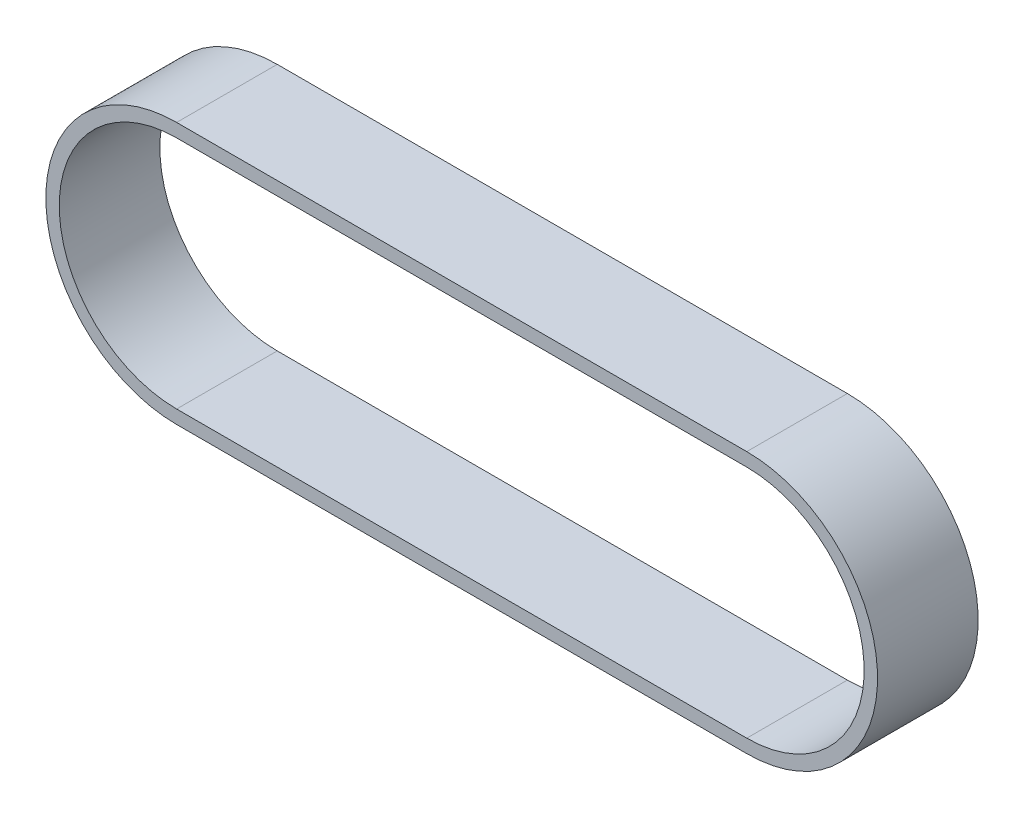
ISO-10303-21;
HEADER;
FILE_DESCRIPTION(('STEP AP214'),'2;1');
FILE_NAME('part.step','',(''),(''),'','','');
FILE_SCHEMA(('AUTOMOTIVE_DESIGN { 1 0 10303 214 1 1 1 1 }'));
ENDSEC;
DATA;
#1=APPLICATION_CONTEXT('core data for automotive mechanical design processes');
#2=APPLICATION_PROTOCOL_DEFINITION('international standard','automotive_design',2000,#1);
#3=PRODUCT_CONTEXT('',#1,'mechanical');
#4=PRODUCT('Part','Part','',(#3));
#5=PRODUCT_RELATED_PRODUCT_CATEGORY('part','',(#4));
#6=PRODUCT_DEFINITION_FORMATION('','',#4);
#7=PRODUCT_DEFINITION_CONTEXT('part definition',#1,'design');
#8=PRODUCT_DEFINITION('design','',#6,#7);
#9=PRODUCT_DEFINITION_SHAPE('','',#8);
#10=(LENGTH_UNIT() NAMED_UNIT(*) SI_UNIT(.MILLI.,.METRE.));
#11=(NAMED_UNIT(*) PLANE_ANGLE_UNIT() SI_UNIT($,.RADIAN.));
#12=(NAMED_UNIT(*) SI_UNIT($,.STERADIAN.) SOLID_ANGLE_UNIT());
#13=UNCERTAINTY_MEASURE_WITH_UNIT(LENGTH_MEASURE(1.E-05),#10,'distance_accuracy_value','');
#14=(GEOMETRIC_REPRESENTATION_CONTEXT(3) GLOBAL_UNCERTAINTY_ASSIGNED_CONTEXT((#13)) GLOBAL_UNIT_ASSIGNED_CONTEXT((#10,
#11,#12)) REPRESENTATION_CONTEXT('',''));
#15=CARTESIAN_POINT('',(0.,0.,0.));
#16=DIRECTION('',(0.,0.,1.));
#17=DIRECTION('',(1.,0.,0.));
#18=AXIS2_PLACEMENT_3D('',#15,#16,#17);
#19=CARTESIAN_POINT('',(-42.5,0.,-7.5));
#20=DIRECTION('',(0.,0.,1.));
#21=DIRECTION('',(1.,0.,0.));
#22=AXIS2_PLACEMENT_3D('',#19,#20,#21);
#23=CYLINDRICAL_SURFACE('',#22,19.5);
#24=DIRECTION('',(0.,0.,1.));
#25=VECTOR('',#24,1.);
#26=CARTESIAN_POINT('',(-42.5,-19.5,-7.5));
#27=LINE('',#26,#25);
#28=CARTESIAN_POINT('',(-42.5,-19.5,-7.5));
#29=VERTEX_POINT('',#28);
#30=CARTESIAN_POINT('',(-42.5,-19.5,7.5));
#31=VERTEX_POINT('',#30);
#32=EDGE_CURVE('E38',#29,#31,#27,.T.);
#33=ORIENTED_EDGE('',*,*,#32,.T.);
#34=CARTESIAN_POINT('',(-42.5,0.,7.5));
#35=DIRECTION('',(0.,0.,1.));
#36=DIRECTION('',(-1.,0.,0.));
#37=AXIS2_PLACEMENT_3D('',#34,#35,#36);
#38=CIRCLE('',#37,19.5);
#39=CARTESIAN_POINT('',(-42.5,19.5,7.5));
#40=VERTEX_POINT('',#39);
#41=EDGE_CURVE('E130',#40,#31,#38,.T.);
#42=ORIENTED_EDGE('',*,*,#41,.F.);
#43=DIRECTION('',(0.,0.,1.));
#44=VECTOR('',#43,1.);
#45=CARTESIAN_POINT('',(-42.5,19.5,-7.5));
#46=LINE('',#45,#44);
#47=CARTESIAN_POINT('',(-42.5,19.5,-7.5));
#48=VERTEX_POINT('',#47);
#49=EDGE_CURVE('E11',#48,#40,#46,.T.);
#50=ORIENTED_EDGE('',*,*,#49,.F.);
#51=CARTESIAN_POINT('',(-42.5,0.,-7.5));
#52=DIRECTION('',(0.,0.,1.));
#53=DIRECTION('',(-1.,0.,0.));
#54=AXIS2_PLACEMENT_3D('',#51,#52,#53);
#55=CIRCLE('',#54,19.5);
#56=EDGE_CURVE('E149',#48,#29,#55,.T.);
#57=ORIENTED_EDGE('',*,*,#56,.T.);
#58=EDGE_LOOP('',(#33,#42,#50,#57));
#59=FACE_BOUND('',#58,.T.);
#60=ADVANCED_FACE('F35',(#59),#23,.T.);
#61=CARTESIAN_POINT('',(-42.5,19.5,-7.5));
#62=DIRECTION('',(0.,1.,0.));
#63=DIRECTION('',(0.,0.,1.));
#64=AXIS2_PLACEMENT_3D('',#61,#62,#63);
#65=PLANE('',#64);
#66=ORIENTED_EDGE('',*,*,#49,.T.);
#67=DIRECTION('',(-1.,0.,0.));
#68=VECTOR('',#67,1.);
#69=CARTESIAN_POINT('',(-42.5,19.5,7.5));
#70=LINE('',#69,#68);
#71=CARTESIAN_POINT('',(42.5,19.5,7.5));
#72=VERTEX_POINT('',#71);
#73=EDGE_CURVE('E139',#72,#40,#70,.T.);
#74=ORIENTED_EDGE('',*,*,#73,.F.);
#75=DIRECTION('',(0.,0.,1.));
#76=VECTOR('',#75,1.);
#77=CARTESIAN_POINT('',(42.5,19.5,-7.5));
#78=LINE('',#77,#76);
#79=CARTESIAN_POINT('',(42.5,19.5,-7.5));
#80=VERTEX_POINT('',#79);
#81=EDGE_CURVE('E43',#80,#72,#78,.T.);
#82=ORIENTED_EDGE('',*,*,#81,.F.);
#83=DIRECTION('',(-1.,0.,0.));
#84=VECTOR('',#83,1.);
#85=CARTESIAN_POINT('',(-42.5,19.5,-7.5));
#86=LINE('',#85,#84);
#87=EDGE_CURVE('E160',#80,#48,#86,.T.);
#88=ORIENTED_EDGE('',*,*,#87,.T.);
#89=EDGE_LOOP('',(#66,#74,#82,#88));
#90=FACE_BOUND('',#89,.T.);
#91=ADVANCED_FACE('F172',(#90),#65,.T.);
#92=CARTESIAN_POINT('',(42.5,0.,-7.5));
#93=DIRECTION('',(0.,0.,1.));
#94=DIRECTION('',(1.,0.,0.));
#95=AXIS2_PLACEMENT_3D('',#92,#93,#94);
#96=CYLINDRICAL_SURFACE('',#95,19.5);
#97=ORIENTED_EDGE('',*,*,#81,.T.);
#98=CARTESIAN_POINT('',(42.5,0.,7.5));
#99=DIRECTION('',(0.,0.,1.));
#100=DIRECTION('',(-1.,0.,0.));
#101=AXIS2_PLACEMENT_3D('',#98,#99,#100);
#102=CIRCLE('',#101,19.5);
#103=CARTESIAN_POINT('',(42.5,-19.5,7.5));
#104=VERTEX_POINT('',#103);
#105=EDGE_CURVE('E136',#104,#72,#102,.T.);
#106=ORIENTED_EDGE('',*,*,#105,.F.);
#107=DIRECTION('',(0.,0.,1.));
#108=VECTOR('',#107,1.);
#109=CARTESIAN_POINT('',(42.5,-19.5,-7.5));
#110=LINE('',#109,#108);
#111=CARTESIAN_POINT('',(42.5,-19.5,-7.5));
#112=VERTEX_POINT('',#111);
#113=EDGE_CURVE('E163',#112,#104,#110,.T.);
#114=ORIENTED_EDGE('',*,*,#113,.F.);
#115=CARTESIAN_POINT('',(42.5,0.,-7.5));
#116=DIRECTION('',(0.,0.,1.));
#117=DIRECTION('',(-1.,0.,0.));
#118=AXIS2_PLACEMENT_3D('',#115,#116,#117);
#119=CIRCLE('',#118,19.5);
#120=EDGE_CURVE('E157',#112,#80,#119,.T.);
#121=ORIENTED_EDGE('',*,*,#120,.T.);
#122=EDGE_LOOP('',(#97,#106,#114,#121));
#123=FACE_BOUND('',#122,.T.);
#124=ADVANCED_FACE('F178',(#123),#96,.T.);
#125=CARTESIAN_POINT('',(-42.5,-19.5,-7.5));
#126=DIRECTION('',(0.,-1.,0.));
#127=DIRECTION('',(1.,0.,0.));
#128=AXIS2_PLACEMENT_3D('',#125,#126,#127);
#129=PLANE('',#128);
#130=ORIENTED_EDGE('',*,*,#113,.T.);
#131=DIRECTION('',(1.,0.,0.));
#132=VECTOR('',#131,1.);
#133=CARTESIAN_POINT('',(-42.5,-19.5,7.5));
#134=LINE('',#133,#132);
#135=EDGE_CURVE('E133',#31,#104,#134,.T.);
#136=ORIENTED_EDGE('',*,*,#135,.F.);
#137=ORIENTED_EDGE('',*,*,#32,.F.);
#138=DIRECTION('',(1.,0.,0.));
#139=VECTOR('',#138,1.);
#140=CARTESIAN_POINT('',(-42.5,-19.5,-7.5));
#141=LINE('',#140,#139);
#142=EDGE_CURVE('E154',#29,#112,#141,.T.);
#143=ORIENTED_EDGE('',*,*,#142,.T.);
#144=EDGE_LOOP('',(#130,#136,#137,#143));
#145=FACE_BOUND('',#144,.T.);
#146=ADVANCED_FACE('F167',(#145),#129,.T.);
#147=CARTESIAN_POINT('',(-42.5,0.,-7.5));
#148=DIRECTION('',(0.,0.,-1.));
#149=DIRECTION('',(-1.,0.,0.));
#150=AXIS2_PLACEMENT_3D('',#147,#148,#149);
#151=PLANE('',#150);
#152=CARTESIAN_POINT('',(-42.5,0.,-7.5));
#153=DIRECTION('',(0.,0.,1.));
#154=DIRECTION('',(-1.,0.,0.));
#155=AXIS2_PLACEMENT_3D('',#152,#153,#154);
#156=CIRCLE('',#155,17.5);
#157=CARTESIAN_POINT('',(-42.5,17.5,-7.5));
#158=VERTEX_POINT('',#157);
#159=CARTESIAN_POINT('',(-42.5,-17.5,-7.5));
#160=VERTEX_POINT('',#159);
#161=EDGE_CURVE('E142',#158,#160,#156,.T.);
#162=ORIENTED_EDGE('',*,*,#161,.T.);
#163=DIRECTION('',(1.,0.,0.));
#164=VECTOR('',#163,1.);
#165=CARTESIAN_POINT('',(-42.5,-17.5,-7.5));
#166=LINE('',#165,#164);
#167=CARTESIAN_POINT('',(42.5,-17.5,-7.5));
#168=VERTEX_POINT('',#167);
#169=EDGE_CURVE('E107',#160,#168,#166,.T.);
#170=ORIENTED_EDGE('',*,*,#169,.T.);
#171=CARTESIAN_POINT('',(42.5,0.,-7.5));
#172=DIRECTION('',(0.,0.,1.));
#173=DIRECTION('',(-1.,0.,0.));
#174=AXIS2_PLACEMENT_3D('',#171,#172,#173);
#175=CIRCLE('',#174,17.5);
#176=CARTESIAN_POINT('',(42.5,17.5,-7.5));
#177=VERTEX_POINT('',#176);
#178=EDGE_CURVE('E51',#168,#177,#175,.T.);
#179=ORIENTED_EDGE('',*,*,#178,.T.);
#180=DIRECTION('',(-1.,0.,0.));
#181=VECTOR('',#180,1.);
#182=CARTESIAN_POINT('',(-42.5,17.5,-7.5));
#183=LINE('',#182,#181);
#184=EDGE_CURVE('E112',#177,#158,#183,.T.);
#185=ORIENTED_EDGE('',*,*,#184,.T.);
#186=EDGE_LOOP('',(#162,#170,#179,#185));
#187=FACE_BOUND('',#186,.T.);
#188=ORIENTED_EDGE('',*,*,#56,.F.);
#189=ORIENTED_EDGE('',*,*,#87,.F.);
#190=ORIENTED_EDGE('',*,*,#120,.F.);
#191=ORIENTED_EDGE('',*,*,#142,.F.);
#192=EDGE_LOOP('',(#188,#189,#190,#191));
#193=FACE_BOUND('',#192,.T.);
#194=ADVANCED_FACE('F176',(#187,#193),#151,.T.);
#195=CARTESIAN_POINT('',(-42.5,0.,-7.5));
#196=DIRECTION('',(0.,0.,1.));
#197=DIRECTION('',(1.,0.,0.));
#198=AXIS2_PLACEMENT_3D('',#195,#196,#197);
#199=CYLINDRICAL_SURFACE('',#198,17.5);
#200=DIRECTION('',(0.,0.,1.));
#201=VECTOR('',#200,1.);
#202=CARTESIAN_POINT('',(-42.5,17.5,-7.5));
#203=LINE('',#202,#201);
#204=CARTESIAN_POINT('',(-42.5,17.5,7.5));
#205=VERTEX_POINT('',#204);
#206=EDGE_CURVE('E117',#158,#205,#203,.T.);
#207=ORIENTED_EDGE('',*,*,#206,.T.);
#208=CARTESIAN_POINT('',(-42.5,0.,7.5));
#209=DIRECTION('',(0.,0.,1.));
#210=DIRECTION('',(-1.,0.,0.));
#211=AXIS2_PLACEMENT_3D('',#208,#209,#210);
#212=CIRCLE('',#211,17.5);
#213=CARTESIAN_POINT('',(-42.5,-17.5,7.5));
#214=VERTEX_POINT('',#213);
#215=EDGE_CURVE('E115',#205,#214,#212,.T.);
#216=ORIENTED_EDGE('',*,*,#215,.T.);
#217=DIRECTION('',(0.,0.,1.));
#218=VECTOR('',#217,1.);
#219=CARTESIAN_POINT('',(-42.5,-17.5,-7.5));
#220=LINE('',#219,#218);
#221=EDGE_CURVE('E100',#160,#214,#220,.T.);
#222=ORIENTED_EDGE('',*,*,#221,.F.);
#223=ORIENTED_EDGE('',*,*,#161,.F.);
#224=EDGE_LOOP('',(#207,#216,#222,#223));
#225=FACE_BOUND('',#224,.T.);
#226=ADVANCED_FACE('F116',(#225),#199,.F.);
#227=CARTESIAN_POINT('',(-42.5,17.5,-7.5));
#228=DIRECTION('',(0.,1.,0.));
#229=DIRECTION('',(-1.,0.,0.));
#230=AXIS2_PLACEMENT_3D('',#227,#228,#229);
#231=PLANE('',#230);
#232=DIRECTION('',(0.,0.,1.));
#233=VECTOR('',#232,1.);
#234=CARTESIAN_POINT('',(42.5,17.5,-7.5));
#235=LINE('',#234,#233);
#236=CARTESIAN_POINT('',(42.5,17.5,7.5));
#237=VERTEX_POINT('',#236);
#238=EDGE_CURVE('E150',#177,#237,#235,.T.);
#239=ORIENTED_EDGE('',*,*,#238,.T.);
#240=DIRECTION('',(-1.,0.,0.));
#241=VECTOR('',#240,1.);
#242=CARTESIAN_POINT('',(-42.5,17.5,7.5));
#243=LINE('',#242,#241);
#244=EDGE_CURVE('E126',#237,#205,#243,.T.);
#245=ORIENTED_EDGE('',*,*,#244,.T.);
#246=ORIENTED_EDGE('',*,*,#206,.F.);
#247=ORIENTED_EDGE('',*,*,#184,.F.);
#248=EDGE_LOOP('',(#239,#245,#246,#247));
#249=FACE_BOUND('',#248,.T.);
#250=ADVANCED_FACE('F221',(#249),#231,.F.);
#251=CARTESIAN_POINT('',(42.5,0.,-7.5));
#252=DIRECTION('',(0.,0.,1.));
#253=DIRECTION('',(1.,0.,0.));
#254=AXIS2_PLACEMENT_3D('',#251,#252,#253);
#255=CYLINDRICAL_SURFACE('',#254,17.5);
#256=DIRECTION('',(0.,0.,1.));
#257=VECTOR('',#256,1.);
#258=CARTESIAN_POINT('',(42.5,-17.5,-7.5));
#259=LINE('',#258,#257);
#260=CARTESIAN_POINT('',(42.5,-17.5,7.5));
#261=VERTEX_POINT('',#260);
#262=EDGE_CURVE('E111',#168,#261,#259,.T.);
#263=ORIENTED_EDGE('',*,*,#262,.T.);
#264=CARTESIAN_POINT('',(42.5,0.,7.5));
#265=DIRECTION('',(0.,0.,1.));
#266=DIRECTION('',(-1.,0.,0.));
#267=AXIS2_PLACEMENT_3D('',#264,#265,#266);
#268=CIRCLE('',#267,17.5);
#269=EDGE_CURVE('E124',#261,#237,#268,.T.);
#270=ORIENTED_EDGE('',*,*,#269,.T.);
#271=ORIENTED_EDGE('',*,*,#238,.F.);
#272=ORIENTED_EDGE('',*,*,#178,.F.);
#273=EDGE_LOOP('',(#263,#270,#271,#272));
#274=FACE_BOUND('',#273,.T.);
#275=ADVANCED_FACE('F230',(#274),#255,.F.);
#276=CARTESIAN_POINT('',(-42.5,-17.5,-7.5));
#277=DIRECTION('',(0.,-1.,0.));
#278=DIRECTION('',(1.,0.,0.));
#279=AXIS2_PLACEMENT_3D('',#276,#277,#278);
#280=PLANE('',#279);
#281=ORIENTED_EDGE('',*,*,#221,.T.);
#282=DIRECTION('',(1.,0.,0.));
#283=VECTOR('',#282,1.);
#284=CARTESIAN_POINT('',(-42.5,-17.5,7.5));
#285=LINE('',#284,#283);
#286=EDGE_CURVE('E104',#214,#261,#285,.T.);
#287=ORIENTED_EDGE('',*,*,#286,.T.);
#288=ORIENTED_EDGE('',*,*,#262,.F.);
#289=ORIENTED_EDGE('',*,*,#169,.F.);
#290=EDGE_LOOP('',(#281,#287,#288,#289));
#291=FACE_BOUND('',#290,.T.);
#292=ADVANCED_FACE('F102',(#291),#280,.F.);
#293=CARTESIAN_POINT('',(-42.5,0.,7.5));
#294=DIRECTION('',(0.,0.,-1.));
#295=DIRECTION('',(-1.,0.,0.));
#296=AXIS2_PLACEMENT_3D('',#293,#294,#295);
#297=PLANE('',#296);
#298=ORIENTED_EDGE('',*,*,#41,.T.);
#299=ORIENTED_EDGE('',*,*,#135,.T.);
#300=ORIENTED_EDGE('',*,*,#105,.T.);
#301=ORIENTED_EDGE('',*,*,#73,.T.);
#302=EDGE_LOOP('',(#298,#299,#300,#301));
#303=FACE_BOUND('',#302,.T.);
#304=ORIENTED_EDGE('',*,*,#215,.F.);
#305=ORIENTED_EDGE('',*,*,#244,.F.);
#306=ORIENTED_EDGE('',*,*,#269,.F.);
#307=ORIENTED_EDGE('',*,*,#286,.F.);
#308=EDGE_LOOP('',(#304,#305,#306,#307));
#309=FACE_BOUND('',#308,.T.);
#310=ADVANCED_FACE('F122',(#303,#309),#297,.F.);
#311=CLOSED_SHELL('',(#60,#91,#124,#146,#194,#226,#250,#275,#292,#310));
#312=MANIFOLD_SOLID_BREP('B2',#311);
#313=ADVANCED_BREP_SHAPE_REPRESENTATION('',(#18,#312),#14);
#314=SHAPE_DEFINITION_REPRESENTATION(#9,#313);
ENDSEC;
END-ISO-10303-21;
